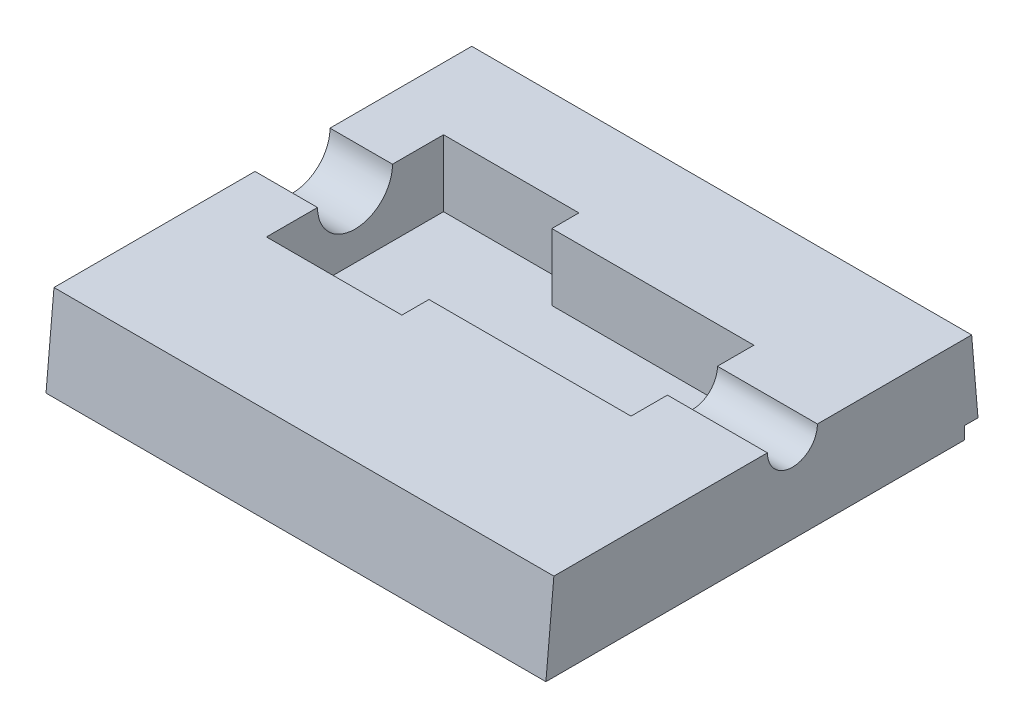
ISO-10303-21;
HEADER;
FILE_DESCRIPTION(('STEP AP214'),'2;1');
FILE_NAME('part.step','',(''),(''),'','','');
FILE_SCHEMA(('AUTOMOTIVE_DESIGN { 1 0 10303 214 1 1 1 1 }'));
ENDSEC;
DATA;
#1=APPLICATION_CONTEXT('core data for automotive mechanical design processes');
#2=APPLICATION_PROTOCOL_DEFINITION('international standard','automotive_design',2000,#1);
#3=PRODUCT_CONTEXT('',#1,'mechanical');
#4=PRODUCT('Part','Part','',(#3));
#5=PRODUCT_RELATED_PRODUCT_CATEGORY('part','',(#4));
#6=PRODUCT_DEFINITION_FORMATION('','',#4);
#7=PRODUCT_DEFINITION_CONTEXT('part definition',#1,'design');
#8=PRODUCT_DEFINITION('design','',#6,#7);
#9=PRODUCT_DEFINITION_SHAPE('','',#8);
#10=(LENGTH_UNIT() NAMED_UNIT(*) SI_UNIT(.MILLI.,.METRE.));
#11=(NAMED_UNIT(*) PLANE_ANGLE_UNIT() SI_UNIT($,.RADIAN.));
#12=(NAMED_UNIT(*) SI_UNIT($,.STERADIAN.) SOLID_ANGLE_UNIT());
#13=UNCERTAINTY_MEASURE_WITH_UNIT(LENGTH_MEASURE(1.E-05),#10,'distance_accuracy_value','');
#14=(GEOMETRIC_REPRESENTATION_CONTEXT(3) GLOBAL_UNCERTAINTY_ASSIGNED_CONTEXT((#13)) GLOBAL_UNIT_ASSIGNED_CONTEXT((#10,
#11,#12)) REPRESENTATION_CONTEXT('',''));
#15=CARTESIAN_POINT('',(0.,0.,0.));
#16=DIRECTION('',(0.,0.,1.));
#17=DIRECTION('',(1.,0.,0.));
#18=AXIS2_PLACEMENT_3D('',#15,#16,#17);
#19=CARTESIAN_POINT('',(0.,3.2,-8.25));
#20=DIRECTION('',(0.,0.,-1.));
#21=DIRECTION('',(-1.,0.,0.));
#22=AXIS2_PLACEMENT_3D('',#19,#20,#21);
#23=PLANE('',#22);
#24=DIRECTION('',(0.,-1.,0.));
#25=VECTOR('',#24,1.);
#26=CARTESIAN_POINT('',(0.,3.2,-8.25));
#27=LINE('',#26,#25);
#28=CARTESIAN_POINT('',(0.,-0.400000000000003,-8.25));
#29=VERTEX_POINT('',#28);
#30=CARTESIAN_POINT('',(0.,-1.,-8.25));
#31=VERTEX_POINT('',#30);
#32=EDGE_CURVE('E165',#29,#31,#27,.T.);
#33=ORIENTED_EDGE('',*,*,#32,.F.);
#34=DIRECTION('',(1.,0.,0.));
#35=VECTOR('',#34,1.);
#36=CARTESIAN_POINT('',(-5.52172685449229,-0.400000000000003,-8.25));
#37=LINE('',#36,#35);
#38=CARTESIAN_POINT('',(24.,-0.400000000000003,-8.25));
#39=VERTEX_POINT('',#38);
#40=EDGE_CURVE('E273',#29,#39,#37,.T.);
#41=ORIENTED_EDGE('',*,*,#40,.T.);
#42=DIRECTION('',(0.,-1.,0.));
#43=VECTOR('',#42,1.);
#44=CARTESIAN_POINT('',(24.,3.2,-8.25));
#45=LINE('',#44,#43);
#46=CARTESIAN_POINT('',(24.,-1.,-8.25));
#47=VERTEX_POINT('',#46);
#48=EDGE_CURVE('E163',#39,#47,#45,.T.);
#49=ORIENTED_EDGE('',*,*,#48,.T.);
#50=DIRECTION('',(1.,0.,0.));
#51=VECTOR('',#50,1.);
#52=CARTESIAN_POINT('',(0.,-1.,-8.25));
#53=LINE('',#52,#51);
#54=EDGE_CURVE('E229',#31,#47,#53,.T.);
#55=ORIENTED_EDGE('',*,*,#54,.F.);
#56=EDGE_LOOP('',(#33,#41,#49,#55));
#57=FACE_BOUND('',#56,.T.);
#58=ADVANCED_FACE('F74',(#57),#23,.T.);
#59=CARTESIAN_POINT('',(19.2,3.2,0.));
#60=DIRECTION('',(-1.,0.,0.));
#61=DIRECTION('',(0.,0.,1.));
#62=AXIS2_PLACEMENT_3D('',#59,#60,#61);
#63=PLANE('',#62);
#64=DIRECTION('',(0.,0.,-1.));
#65=VECTOR('',#64,1.);
#66=CARTESIAN_POINT('',(19.2,0.,0.));
#67=LINE('',#66,#65);
#68=CARTESIAN_POINT('',(19.2,0.,2.95));
#69=VERTEX_POINT('',#68);
#70=CARTESIAN_POINT('',(19.2,0.,-2.95));
#71=VERTEX_POINT('',#70);
#72=EDGE_CURVE('E141',#69,#71,#67,.T.);
#73=ORIENTED_EDGE('',*,*,#72,.F.);
#74=DIRECTION('',(0.,-1.,0.));
#75=VECTOR('',#74,1.);
#76=CARTESIAN_POINT('',(19.2,3.2,2.95));
#77=LINE('',#76,#75);
#78=CARTESIAN_POINT('',(19.2,3.2,2.95));
#79=VERTEX_POINT('',#78);
#80=EDGE_CURVE('E230',#79,#69,#77,.T.);
#81=ORIENTED_EDGE('',*,*,#80,.F.);
#82=DIRECTION('',(0.,0.,1.));
#83=VECTOR('',#82,1.);
#84=CARTESIAN_POINT('',(19.2,3.2,0.));
#85=LINE('',#84,#83);
#86=CARTESIAN_POINT('',(19.2,3.2,1.2));
#87=VERTEX_POINT('',#86);
#88=EDGE_CURVE('E223',#87,#79,#85,.T.);
#89=ORIENTED_EDGE('',*,*,#88,.F.);
#90=CARTESIAN_POINT('',(19.2,3.2,0.));
#91=DIRECTION('',(-1.,0.,0.));
#92=DIRECTION('',(0.,0.,1.));
#93=AXIS2_PLACEMENT_3D('',#90,#91,#92);
#94=CIRCLE('',#93,1.2);
#95=CARTESIAN_POINT('',(19.2,3.2,-1.2));
#96=VERTEX_POINT('',#95);
#97=EDGE_CURVE('E209',#96,#87,#94,.T.);
#98=ORIENTED_EDGE('',*,*,#97,.F.);
#99=DIRECTION('',(0.,0.,-1.));
#100=VECTOR('',#99,1.);
#101=CARTESIAN_POINT('',(19.2,3.2,0.));
#102=LINE('',#101,#100);
#103=CARTESIAN_POINT('',(19.2,3.2,-2.95));
#104=VERTEX_POINT('',#103);
#105=EDGE_CURVE('E235',#96,#104,#102,.T.);
#106=ORIENTED_EDGE('',*,*,#105,.T.);
#107=DIRECTION('',(0.,-1.,0.));
#108=VECTOR('',#107,1.);
#109=CARTESIAN_POINT('',(19.2,3.2,-2.95));
#110=LINE('',#109,#108);
#111=EDGE_CURVE('E12',#104,#71,#110,.T.);
#112=ORIENTED_EDGE('',*,*,#111,.T.);
#113=EDGE_LOOP('',(#73,#81,#89,#98,#106,#112));
#114=FACE_BOUND('',#113,.T.);
#115=ADVANCED_FACE('F357',(#114),#63,.T.);
#116=CARTESIAN_POINT('',(24.,3.2,0.));
#117=DIRECTION('',(1.,0.,0.));
#118=DIRECTION('',(0.,0.,-1.));
#119=AXIS2_PLACEMENT_3D('',#116,#117,#118);
#120=PLANE('',#119);
#121=DIRECTION('',(0.,0.,1.));
#122=VECTOR('',#121,1.);
#123=CARTESIAN_POINT('',(24.,3.2,0.));
#124=LINE('',#123,#122);
#125=CARTESIAN_POINT('',(24.,3.2,-8.60515529470364));
#126=VERTEX_POINT('',#125);
#127=CARTESIAN_POINT('',(24.,3.2,-1.2));
#128=VERTEX_POINT('',#127);
#129=EDGE_CURVE('E83',#126,#128,#124,.T.);
#130=ORIENTED_EDGE('',*,*,#129,.T.);
#131=CARTESIAN_POINT('',(24.,3.2,0.));
#132=DIRECTION('',(-1.,0.,0.));
#133=DIRECTION('',(0.,0.,-1.));
#134=AXIS2_PLACEMENT_3D('',#131,#132,#133);
#135=CIRCLE('',#134,1.2);
#136=CARTESIAN_POINT('',(24.,3.2,1.2));
#137=VERTEX_POINT('',#136);
#138=EDGE_CURVE('E215',#128,#137,#135,.T.);
#139=ORIENTED_EDGE('',*,*,#138,.T.);
#140=DIRECTION('',(0.,0.,-1.));
#141=VECTOR('',#140,1.);
#142=CARTESIAN_POINT('',(24.,3.2,0.));
#143=LINE('',#142,#141);
#144=CARTESIAN_POINT('',(24.,3.2,11.4523076923077));
#145=VERTEX_POINT('',#144);
#146=EDGE_CURVE('E308',#145,#137,#143,.T.);
#147=ORIENTED_EDGE('',*,*,#146,.F.);
#148=DIRECTION('',(0.,-0.995882734463905,0.0906508642909459));
#149=VECTOR('',#148,1.);
#150=CARTESIAN_POINT('',(24.,3.2,11.4523076923077));
#151=LINE('',#150,#149);
#152=CARTESIAN_POINT('',(24.,-1.,11.8346153846154));
#153=VERTEX_POINT('',#152);
#154=EDGE_CURVE('E285',#145,#153,#151,.T.);
#155=ORIENTED_EDGE('',*,*,#154,.T.);
#156=DIRECTION('',(0.,0.,1.));
#157=VECTOR('',#156,1.);
#158=CARTESIAN_POINT('',(24.,-1.,8.25));
#159=LINE('',#158,#157);
#160=EDGE_CURVE('E150',#47,#153,#159,.T.);
#161=ORIENTED_EDGE('',*,*,#160,.F.);
#162=ORIENTED_EDGE('',*,*,#48,.F.);
#163=DIRECTION('',(0.,0.,-1.));
#164=VECTOR('',#163,1.);
#165=CARTESIAN_POINT('',(24.,-0.400000000000003,-8.25));
#166=LINE('',#165,#164);
#167=CARTESIAN_POINT('',(24.,-0.399999999999999,-8.90957411873532));
#168=VERTEX_POINT('',#167);
#169=EDGE_CURVE('E91',#39,#168,#166,.T.);
#170=ORIENTED_EDGE('',*,*,#169,.T.);
#171=DIRECTION('',(0.,0.99644379708425,0.0842600691450143));
#172=VECTOR('',#171,1.);
#173=CARTESIAN_POINT('',(24.,3.2,-8.60515529470364));
#174=LINE('',#173,#172);
#175=EDGE_CURVE('E370',#168,#126,#174,.T.);
#176=ORIENTED_EDGE('',*,*,#175,.T.);
#177=EDGE_LOOP('',(#130,#139,#147,#155,#161,#162,#170,#176));
#178=FACE_BOUND('',#177,.T.);
#179=ADVANCED_FACE('F368',(#178),#120,.T.);
#180=CARTESIAN_POINT('',(0.,3.2,0.));
#181=DIRECTION('',(0.,1.,0.));
#182=DIRECTION('',(0.,0.,1.));
#183=AXIS2_PLACEMENT_3D('',#180,#181,#182);
#184=PLANE('',#183);
#185=ORIENTED_EDGE('',*,*,#105,.F.);
#186=DIRECTION('',(-1.,0.,0.));
#187=VECTOR('',#186,1.);
#188=CARTESIAN_POINT('',(0.,3.2,-1.2));
#189=LINE('',#188,#187);
#190=EDGE_CURVE('E238',#128,#96,#189,.T.);
#191=ORIENTED_EDGE('',*,*,#190,.F.);
#192=ORIENTED_EDGE('',*,*,#129,.F.);
#193=DIRECTION('',(1.,0.,0.));
#194=VECTOR('',#193,1.);
#195=CARTESIAN_POINT('',(-5.52172685449229,3.2,-8.60515529470364));
#196=LINE('',#195,#194);
#197=CARTESIAN_POINT('',(0.,3.2,-8.60515529470364));
#198=VERTEX_POINT('',#197);
#199=EDGE_CURVE('E265',#198,#126,#196,.T.);
#200=ORIENTED_EDGE('',*,*,#199,.F.);
#201=DIRECTION('',(0.,0.,-1.));
#202=VECTOR('',#201,1.);
#203=CARTESIAN_POINT('',(0.,3.2,-1.8));
#204=LINE('',#203,#202);
#205=CARTESIAN_POINT('',(0.,3.2,-1.8));
#206=VERTEX_POINT('',#205);
#207=EDGE_CURVE('E175',#206,#198,#204,.T.);
#208=ORIENTED_EDGE('',*,*,#207,.F.);
#209=DIRECTION('',(-1.,0.,0.));
#210=VECTOR('',#209,1.);
#211=CARTESIAN_POINT('',(3.,3.2,-1.8));
#212=LINE('',#211,#210);
#213=CARTESIAN_POINT('',(3.,3.2,-1.8));
#214=VERTEX_POINT('',#213);
#215=EDGE_CURVE('E246',#214,#206,#212,.T.);
#216=ORIENTED_EDGE('',*,*,#215,.F.);
#217=DIRECTION('',(0.,0.,1.));
#218=VECTOR('',#217,1.);
#219=CARTESIAN_POINT('',(3.,3.2,-4.25));
#220=LINE('',#219,#218);
#221=CARTESIAN_POINT('',(3.,3.2,-4.25));
#222=VERTEX_POINT('',#221);
#223=EDGE_CURVE('E157',#222,#214,#220,.T.);
#224=ORIENTED_EDGE('',*,*,#223,.F.);
#225=DIRECTION('',(-1.,0.,0.));
#226=VECTOR('',#225,1.);
#227=CARTESIAN_POINT('',(9.5,3.2,-4.25));
#228=LINE('',#227,#226);
#229=CARTESIAN_POINT('',(9.5,3.2,-4.25));
#230=VERTEX_POINT('',#229);
#231=EDGE_CURVE('E155',#230,#222,#228,.T.);
#232=ORIENTED_EDGE('',*,*,#231,.F.);
#233=DIRECTION('',(0.,0.,-1.));
#234=VECTOR('',#233,1.);
#235=CARTESIAN_POINT('',(9.5,3.2,-2.95));
#236=LINE('',#235,#234);
#237=CARTESIAN_POINT('',(9.5,3.2,-2.95));
#238=VERTEX_POINT('',#237);
#239=EDGE_CURVE('E137',#238,#230,#236,.T.);
#240=ORIENTED_EDGE('',*,*,#239,.F.);
#241=DIRECTION('',(-1.,0.,0.));
#242=VECTOR('',#241,1.);
#243=CARTESIAN_POINT('',(24.,3.2,-2.95));
#244=LINE('',#243,#242);
#245=EDGE_CURVE('E173',#104,#238,#244,.T.);
#246=ORIENTED_EDGE('',*,*,#245,.F.);
#247=EDGE_LOOP('',(#185,#191,#192,#200,#208,#216,#224,#232,#240,#246));
#248=FACE_BOUND('',#247,.T.);
#249=ADVANCED_FACE('F267',(#248),#184,.T.);
#250=CARTESIAN_POINT('',(9.5,3.2,-2.95));
#251=DIRECTION('',(-1.,0.,0.));
#252=DIRECTION('',(0.,0.,1.));
#253=AXIS2_PLACEMENT_3D('',#250,#251,#252);
#254=PLANE('',#253);
#255=DIRECTION('',(0.,0.,-1.));
#256=VECTOR('',#255,1.);
#257=CARTESIAN_POINT('',(9.5,0.,-2.95));
#258=LINE('',#257,#256);
#259=CARTESIAN_POINT('',(9.5,0.,-2.95));
#260=VERTEX_POINT('',#259);
#261=CARTESIAN_POINT('',(9.5,0.,-4.25));
#262=VERTEX_POINT('',#261);
#263=EDGE_CURVE('E134',#260,#262,#258,.T.);
#264=ORIENTED_EDGE('',*,*,#263,.F.);
#265=DIRECTION('',(0.,-1.,0.));
#266=VECTOR('',#265,1.);
#267=CARTESIAN_POINT('',(9.5,3.2,-2.95));
#268=LINE('',#267,#266);
#269=EDGE_CURVE('E142',#238,#260,#268,.T.);
#270=ORIENTED_EDGE('',*,*,#269,.F.);
#271=ORIENTED_EDGE('',*,*,#239,.T.);
#272=DIRECTION('',(0.,-1.,0.));
#273=VECTOR('',#272,1.);
#274=CARTESIAN_POINT('',(9.5,3.2,-4.25));
#275=LINE('',#274,#273);
#276=EDGE_CURVE('E129',#230,#262,#275,.T.);
#277=ORIENTED_EDGE('',*,*,#276,.T.);
#278=EDGE_LOOP('',(#264,#270,#271,#277));
#279=FACE_BOUND('',#278,.T.);
#280=ADVANCED_FACE('F131',(#279),#254,.T.);
#281=CARTESIAN_POINT('',(24.,3.2,-2.95));
#282=DIRECTION('',(0.,0.,1.));
#283=DIRECTION('',(1.,0.,0.));
#284=AXIS2_PLACEMENT_3D('',#281,#282,#283);
#285=PLANE('',#284);
#286=DIRECTION('',(-1.,0.,0.));
#287=VECTOR('',#286,1.);
#288=CARTESIAN_POINT('',(24.,0.,-2.95));
#289=LINE('',#288,#287);
#290=EDGE_CURVE('E154',#71,#260,#289,.T.);
#291=ORIENTED_EDGE('',*,*,#290,.F.);
#292=ORIENTED_EDGE('',*,*,#111,.F.);
#293=ORIENTED_EDGE('',*,*,#245,.T.);
#294=ORIENTED_EDGE('',*,*,#269,.T.);
#295=EDGE_LOOP('',(#291,#292,#293,#294));
#296=FACE_BOUND('',#295,.T.);
#297=ADVANCED_FACE('F413',(#296),#285,.T.);
#298=CARTESIAN_POINT('',(0.,3.2,-1.8));
#299=DIRECTION('',(-1.,0.,0.));
#300=DIRECTION('',(0.,0.,1.));
#301=AXIS2_PLACEMENT_3D('',#298,#299,#300);
#302=PLANE('',#301);
#303=CARTESIAN_POINT('',(0.,3.2,0.));
#304=DIRECTION('',(1.,0.,0.));
#305=DIRECTION('',(0.,0.,1.));
#306=AXIS2_PLACEMENT_3D('',#303,#304,#305);
#307=CIRCLE('',#306,1.8);
#308=CARTESIAN_POINT('',(0.,3.2,1.8));
#309=VERTEX_POINT('',#308);
#310=EDGE_CURVE('E260',#309,#206,#307,.T.);
#311=ORIENTED_EDGE('',*,*,#310,.T.);
#312=ORIENTED_EDGE('',*,*,#207,.T.);
#313=DIRECTION('',(0.,0.99644379708425,0.0842600691450143));
#314=VECTOR('',#313,1.);
#315=CARTESIAN_POINT('',(0.,3.2,-8.60515529470364));
#316=LINE('',#315,#314);
#317=CARTESIAN_POINT('',(0.,-0.399999999999999,-8.90957411873532));
#318=VERTEX_POINT('',#317);
#319=EDGE_CURVE('E256',#318,#198,#316,.T.);
#320=ORIENTED_EDGE('',*,*,#319,.F.);
#321=DIRECTION('',(0.,0.,-1.));
#322=VECTOR('',#321,1.);
#323=CARTESIAN_POINT('',(0.,-0.400000000000003,-8.25));
#324=LINE('',#323,#322);
#325=EDGE_CURVE('E279',#29,#318,#324,.T.);
#326=ORIENTED_EDGE('',*,*,#325,.F.);
#327=ORIENTED_EDGE('',*,*,#32,.T.);
#328=DIRECTION('',(0.,0.,-1.));
#329=VECTOR('',#328,1.);
#330=CARTESIAN_POINT('',(0.,-1.,8.25));
#331=LINE('',#330,#329);
#332=CARTESIAN_POINT('',(0.,-1.,11.8346153846154));
#333=VERTEX_POINT('',#332);
#334=EDGE_CURVE('E226',#333,#31,#331,.T.);
#335=ORIENTED_EDGE('',*,*,#334,.F.);
#336=DIRECTION('',(0.,-0.995882734463905,0.090650864290946));
#337=VECTOR('',#336,1.);
#338=CARTESIAN_POINT('',(0.,3.2,11.4523076923077));
#339=LINE('',#338,#337);
#340=CARTESIAN_POINT('',(0.,3.2,11.4523076923077));
#341=VERTEX_POINT('',#340);
#342=EDGE_CURVE('E289',#341,#333,#339,.T.);
#343=ORIENTED_EDGE('',*,*,#342,.F.);
#344=DIRECTION('',(0.,0.,1.));
#345=VECTOR('',#344,1.);
#346=CARTESIAN_POINT('',(0.,3.2,1.8));
#347=LINE('',#346,#345);
#348=EDGE_CURVE('E318',#309,#341,#347,.T.);
#349=ORIENTED_EDGE('',*,*,#348,.F.);
#350=EDGE_LOOP('',(#311,#312,#320,#326,#327,#335,#343,#349));
#351=FACE_BOUND('',#350,.T.);
#352=ADVANCED_FACE('F253',(#351),#302,.T.);
#353=CARTESIAN_POINT('',(3.,3.2,-4.25));
#354=DIRECTION('',(1.,0.,0.));
#355=DIRECTION('',(0.,0.,-1.));
#356=AXIS2_PLACEMENT_3D('',#353,#354,#355);
#357=PLANE('',#356);
#358=DIRECTION('',(0.,0.,1.));
#359=VECTOR('',#358,1.);
#360=CARTESIAN_POINT('',(3.,0.,-4.25));
#361=LINE('',#360,#359);
#362=CARTESIAN_POINT('',(3.,0.,-4.25));
#363=VERTEX_POINT('',#362);
#364=CARTESIAN_POINT('',(3.,0.,4.25));
#365=VERTEX_POINT('',#364);
#366=EDGE_CURVE('E149',#363,#365,#361,.T.);
#367=ORIENTED_EDGE('',*,*,#366,.F.);
#368=DIRECTION('',(0.,-1.,0.));
#369=VECTOR('',#368,1.);
#370=CARTESIAN_POINT('',(3.,3.2,-4.25));
#371=LINE('',#370,#369);
#372=EDGE_CURVE('E78',#222,#363,#371,.T.);
#373=ORIENTED_EDGE('',*,*,#372,.F.);
#374=ORIENTED_EDGE('',*,*,#223,.T.);
#375=CARTESIAN_POINT('',(3.,3.2,0.));
#376=DIRECTION('',(1.,0.,0.));
#377=DIRECTION('',(0.,0.,-1.));
#378=AXIS2_PLACEMENT_3D('',#375,#376,#377);
#379=CIRCLE('',#378,1.8);
#380=CARTESIAN_POINT('',(3.,3.2,1.8));
#381=VERTEX_POINT('',#380);
#382=EDGE_CURVE('E298',#381,#214,#379,.T.);
#383=ORIENTED_EDGE('',*,*,#382,.F.);
#384=DIRECTION('',(0.,0.,-1.));
#385=VECTOR('',#384,1.);
#386=CARTESIAN_POINT('',(3.,3.2,4.25));
#387=LINE('',#386,#385);
#388=CARTESIAN_POINT('',(3.,3.2,4.25));
#389=VERTEX_POINT('',#388);
#390=EDGE_CURVE('E196',#389,#381,#387,.T.);
#391=ORIENTED_EDGE('',*,*,#390,.F.);
#392=DIRECTION('',(0.,-1.,0.));
#393=VECTOR('',#392,1.);
#394=CARTESIAN_POINT('',(3.,3.2,4.25));
#395=LINE('',#394,#393);
#396=EDGE_CURVE('E191',#389,#365,#395,.T.);
#397=ORIENTED_EDGE('',*,*,#396,.T.);
#398=EDGE_LOOP('',(#367,#373,#374,#383,#391,#397));
#399=FACE_BOUND('',#398,.T.);
#400=ADVANCED_FACE('F192',(#399),#357,.T.);
#401=CARTESIAN_POINT('',(9.5,3.2,-4.25));
#402=DIRECTION('',(0.,0.,1.));
#403=DIRECTION('',(1.,0.,0.));
#404=AXIS2_PLACEMENT_3D('',#401,#402,#403);
#405=PLANE('',#404);
#406=DIRECTION('',(-1.,0.,0.));
#407=VECTOR('',#406,1.);
#408=CARTESIAN_POINT('',(9.5,0.,-4.25));
#409=LINE('',#408,#407);
#410=EDGE_CURVE('E145',#262,#363,#409,.T.);
#411=ORIENTED_EDGE('',*,*,#410,.F.);
#412=ORIENTED_EDGE('',*,*,#276,.F.);
#413=ORIENTED_EDGE('',*,*,#231,.T.);
#414=ORIENTED_EDGE('',*,*,#372,.T.);
#415=EDGE_LOOP('',(#411,#412,#413,#414));
#416=FACE_BOUND('',#415,.T.);
#417=ADVANCED_FACE('F76',(#416),#405,.T.);
#418=CARTESIAN_POINT('',(0.,0.,0.));
#419=DIRECTION('',(0.,-1.,0.));
#420=DIRECTION('',(0.,0.,-1.));
#421=AXIS2_PLACEMENT_3D('',#418,#419,#420);
#422=PLANE('',#421);
#423=ORIENTED_EDGE('',*,*,#366,.T.);
#424=DIRECTION('',(-1.,0.,0.));
#425=VECTOR('',#424,1.);
#426=CARTESIAN_POINT('',(9.5,0.,4.25));
#427=LINE('',#426,#425);
#428=CARTESIAN_POINT('',(9.5,0.,4.25));
#429=VERTEX_POINT('',#428);
#430=EDGE_CURVE('E184',#429,#365,#427,.T.);
#431=ORIENTED_EDGE('',*,*,#430,.F.);
#432=DIRECTION('',(0.,0.,1.));
#433=VECTOR('',#432,1.);
#434=CARTESIAN_POINT('',(9.5,0.,2.95));
#435=LINE('',#434,#433);
#436=CARTESIAN_POINT('',(9.5,0.,2.95));
#437=VERTEX_POINT('',#436);
#438=EDGE_CURVE('E212',#437,#429,#435,.T.);
#439=ORIENTED_EDGE('',*,*,#438,.F.);
#440=DIRECTION('',(-1.,0.,0.));
#441=VECTOR('',#440,1.);
#442=CARTESIAN_POINT('',(24.,0.,2.95));
#443=LINE('',#442,#441);
#444=EDGE_CURVE('E208',#69,#437,#443,.T.);
#445=ORIENTED_EDGE('',*,*,#444,.F.);
#446=ORIENTED_EDGE('',*,*,#72,.T.);
#447=ORIENTED_EDGE('',*,*,#290,.T.);
#448=ORIENTED_EDGE('',*,*,#263,.T.);
#449=ORIENTED_EDGE('',*,*,#410,.T.);
#450=EDGE_LOOP('',(#423,#431,#439,#445,#446,#447,#448,#449));
#451=FACE_BOUND('',#450,.T.);
#452=ADVANCED_FACE('F152',(#451),#422,.F.);
#453=CARTESIAN_POINT('',(0.,-1.,0.));
#454=DIRECTION('',(0.,-1.,0.));
#455=DIRECTION('',(0.,0.,-1.));
#456=AXIS2_PLACEMENT_3D('',#453,#454,#455);
#457=PLANE('',#456);
#458=ORIENTED_EDGE('',*,*,#334,.T.);
#459=ORIENTED_EDGE('',*,*,#54,.T.);
#460=ORIENTED_EDGE('',*,*,#160,.T.);
#461=DIRECTION('',(1.,0.,0.));
#462=VECTOR('',#461,1.);
#463=CARTESIAN_POINT('',(-5.52172685449229,-1.,11.8346153846154));
#464=LINE('',#463,#462);
#465=EDGE_CURVE('E292',#333,#153,#464,.T.);
#466=ORIENTED_EDGE('',*,*,#465,.F.);
#467=EDGE_LOOP('',(#458,#459,#460,#466));
#468=FACE_BOUND('',#467,.T.);
#469=ADVANCED_FACE('F396',(#468),#457,.T.);
#470=CARTESIAN_POINT('',(0.,3.2,0.));
#471=DIRECTION('',(0.,1.,0.));
#472=DIRECTION('',(0.,0.,-1.));
#473=AXIS2_PLACEMENT_3D('',#470,#471,#472);
#474=PLANE('',#473);
#475=ORIENTED_EDGE('',*,*,#88,.T.);
#476=DIRECTION('',(-1.,0.,0.));
#477=VECTOR('',#476,1.);
#478=CARTESIAN_POINT('',(24.,3.2,2.95));
#479=LINE('',#478,#477);
#480=CARTESIAN_POINT('',(9.5,3.2,2.95));
#481=VERTEX_POINT('',#480);
#482=EDGE_CURVE('E320',#79,#481,#479,.T.);
#483=ORIENTED_EDGE('',*,*,#482,.T.);
#484=DIRECTION('',(0.,0.,1.));
#485=VECTOR('',#484,1.);
#486=CARTESIAN_POINT('',(9.5,3.2,2.95));
#487=LINE('',#486,#485);
#488=CARTESIAN_POINT('',(9.5,3.2,4.25));
#489=VERTEX_POINT('',#488);
#490=EDGE_CURVE('E201',#481,#489,#487,.T.);
#491=ORIENTED_EDGE('',*,*,#490,.T.);
#492=DIRECTION('',(-1.,0.,0.));
#493=VECTOR('',#492,1.);
#494=CARTESIAN_POINT('',(9.5,3.2,4.25));
#495=LINE('',#494,#493);
#496=EDGE_CURVE('E221',#489,#389,#495,.T.);
#497=ORIENTED_EDGE('',*,*,#496,.T.);
#498=ORIENTED_EDGE('',*,*,#390,.T.);
#499=DIRECTION('',(-1.,0.,0.));
#500=VECTOR('',#499,1.);
#501=CARTESIAN_POINT('',(3.,3.2,1.8));
#502=LINE('',#501,#500);
#503=EDGE_CURVE('E315',#381,#309,#502,.T.);
#504=ORIENTED_EDGE('',*,*,#503,.T.);
#505=ORIENTED_EDGE('',*,*,#348,.T.);
#506=DIRECTION('',(1.,0.,0.));
#507=VECTOR('',#506,1.);
#508=CARTESIAN_POINT('',(-5.52172685449229,3.2,11.4523076923077));
#509=LINE('',#508,#507);
#510=EDGE_CURVE('E288',#341,#145,#509,.T.);
#511=ORIENTED_EDGE('',*,*,#510,.T.);
#512=ORIENTED_EDGE('',*,*,#146,.T.);
#513=DIRECTION('',(-1.,0.,0.));
#514=VECTOR('',#513,1.);
#515=CARTESIAN_POINT('',(0.,3.2,1.2));
#516=LINE('',#515,#514);
#517=EDGE_CURVE('E305',#137,#87,#516,.T.);
#518=ORIENTED_EDGE('',*,*,#517,.T.);
#519=EDGE_LOOP('',(#475,#483,#491,#497,#498,#504,#505,#511,#512,#518));
#520=FACE_BOUND('',#519,.T.);
#521=ADVANCED_FACE('F328',(#520),#474,.T.);
#522=CARTESIAN_POINT('',(9.5,3.2,2.95));
#523=DIRECTION('',(-1.,0.,0.));
#524=DIRECTION('',(0.,0.,-1.));
#525=AXIS2_PLACEMENT_3D('',#522,#523,#524);
#526=PLANE('',#525);
#527=ORIENTED_EDGE('',*,*,#438,.T.);
#528=DIRECTION('',(0.,-1.,0.));
#529=VECTOR('',#528,1.);
#530=CARTESIAN_POINT('',(9.5,3.2,4.25));
#531=LINE('',#530,#529);
#532=EDGE_CURVE('E206',#489,#429,#531,.T.);
#533=ORIENTED_EDGE('',*,*,#532,.F.);
#534=ORIENTED_EDGE('',*,*,#490,.F.);
#535=DIRECTION('',(0.,-1.,0.));
#536=VECTOR('',#535,1.);
#537=CARTESIAN_POINT('',(9.5,3.2,2.95));
#538=LINE('',#537,#536);
#539=EDGE_CURVE('E200',#481,#437,#538,.T.);
#540=ORIENTED_EDGE('',*,*,#539,.T.);
#541=EDGE_LOOP('',(#527,#533,#534,#540));
#542=FACE_BOUND('',#541,.T.);
#543=ADVANCED_FACE('F332',(#542),#526,.T.);
#544=CARTESIAN_POINT('',(24.,3.2,2.95));
#545=DIRECTION('',(0.,0.,-1.));
#546=DIRECTION('',(1.,0.,0.));
#547=AXIS2_PLACEMENT_3D('',#544,#545,#546);
#548=PLANE('',#547);
#549=ORIENTED_EDGE('',*,*,#444,.T.);
#550=ORIENTED_EDGE('',*,*,#539,.F.);
#551=ORIENTED_EDGE('',*,*,#482,.F.);
#552=ORIENTED_EDGE('',*,*,#80,.T.);
#553=EDGE_LOOP('',(#549,#550,#551,#552));
#554=FACE_BOUND('',#553,.T.);
#555=ADVANCED_FACE('F427',(#554),#548,.T.);
#556=CARTESIAN_POINT('',(9.5,3.2,4.25));
#557=DIRECTION('',(0.,0.,-1.));
#558=DIRECTION('',(1.,0.,0.));
#559=AXIS2_PLACEMENT_3D('',#556,#557,#558);
#560=PLANE('',#559);
#561=ORIENTED_EDGE('',*,*,#430,.T.);
#562=ORIENTED_EDGE('',*,*,#396,.F.);
#563=ORIENTED_EDGE('',*,*,#496,.F.);
#564=ORIENTED_EDGE('',*,*,#532,.T.);
#565=EDGE_LOOP('',(#561,#562,#563,#564));
#566=FACE_BOUND('',#565,.T.);
#567=ADVANCED_FACE('F204',(#566),#560,.T.);
#568=CARTESIAN_POINT('',(15.2,3.2,0.));
#569=DIRECTION('',(1.,0.,0.));
#570=DIRECTION('',(0.,0.,-1.));
#571=AXIS2_PLACEMENT_3D('',#568,#569,#570);
#572=CYLINDRICAL_SURFACE('',#571,1.2);
#573=ORIENTED_EDGE('',*,*,#190,.T.);
#574=ORIENTED_EDGE('',*,*,#97,.T.);
#575=ORIENTED_EDGE('',*,*,#517,.F.);
#576=ORIENTED_EDGE('',*,*,#138,.F.);
#577=EDGE_LOOP('',(#573,#574,#575,#576));
#578=FACE_BOUND('',#577,.T.);
#579=ADVANCED_FACE('F365',(#578),#572,.F.);
#580=CARTESIAN_POINT('',(7.81663783151692,3.2,0.));
#581=DIRECTION('',(-1.,0.,0.));
#582=DIRECTION('',(0.,0.,1.));
#583=AXIS2_PLACEMENT_3D('',#580,#581,#582);
#584=CYLINDRICAL_SURFACE('',#583,1.8);
#585=ORIENTED_EDGE('',*,*,#503,.F.);
#586=ORIENTED_EDGE('',*,*,#382,.T.);
#587=ORIENTED_EDGE('',*,*,#215,.T.);
#588=ORIENTED_EDGE('',*,*,#310,.F.);
#589=EDGE_LOOP('',(#585,#586,#587,#588));
#590=FACE_BOUND('',#589,.T.);
#591=ADVANCED_FACE('F353',(#590),#584,.F.);
#592=CARTESIAN_POINT('',(-5.52172685449229,3.2,11.4523076923077));
#593=DIRECTION('',(0.,0.0906508642909459,0.995882734463905));
#594=DIRECTION('',(0.,-0.995882734463905,0.090650864290946));
#595=AXIS2_PLACEMENT_3D('',#592,#593,#594);
#596=PLANE('',#595);
#597=ORIENTED_EDGE('',*,*,#510,.F.);
#598=ORIENTED_EDGE('',*,*,#342,.T.);
#599=ORIENTED_EDGE('',*,*,#465,.T.);
#600=ORIENTED_EDGE('',*,*,#154,.F.);
#601=EDGE_LOOP('',(#597,#598,#599,#600));
#602=FACE_BOUND('',#601,.T.);
#603=ADVANCED_FACE('F392',(#602),#596,.T.);
#604=CARTESIAN_POINT('',(-5.52172685449229,-0.400000000000003,-8.25));
#605=DIRECTION('',(0.,-1.,0.));
#606=DIRECTION('',(0.,0.,-1.));
#607=AXIS2_PLACEMENT_3D('',#604,#605,#606);
#608=PLANE('',#607);
#609=ORIENTED_EDGE('',*,*,#40,.F.);
#610=ORIENTED_EDGE('',*,*,#325,.T.);
#611=DIRECTION('',(1.,0.,0.));
#612=VECTOR('',#611,1.);
#613=CARTESIAN_POINT('',(-5.52172685449229,-0.399999999999999,-8.90957411873532));
#614=LINE('',#613,#612);
#615=EDGE_CURVE('E276',#318,#168,#614,.T.);
#616=ORIENTED_EDGE('',*,*,#615,.T.);
#617=ORIENTED_EDGE('',*,*,#169,.F.);
#618=EDGE_LOOP('',(#609,#610,#616,#617));
#619=FACE_BOUND('',#618,.T.);
#620=ADVANCED_FACE('F376',(#619),#608,.T.);
#621=CARTESIAN_POINT('',(-5.52172685449229,3.2,-8.60515529470364));
#622=DIRECTION('',(0.,0.0842600691450143,-0.99644379708425));
#623=DIRECTION('',(0.,0.99644379708425,0.0842600691450143));
#624=AXIS2_PLACEMENT_3D('',#621,#622,#623);
#625=PLANE('',#624);
#626=ORIENTED_EDGE('',*,*,#615,.F.);
#627=ORIENTED_EDGE('',*,*,#319,.T.);
#628=ORIENTED_EDGE('',*,*,#199,.T.);
#629=ORIENTED_EDGE('',*,*,#175,.F.);
#630=EDGE_LOOP('',(#626,#627,#628,#629));
#631=FACE_BOUND('',#630,.T.);
#632=ADVANCED_FACE('F275',(#631),#625,.T.);
#633=CLOSED_SHELL('',(#58,#115,#179,#249,#280,#297,#352,#400,#417,#452,#469,#521,#543,#555,#567,
#579,#591,#603,#620,#632));
#634=MANIFOLD_SOLID_BREP('B2',#633);
#635=ADVANCED_BREP_SHAPE_REPRESENTATION('',(#18,#634),#14);
#636=SHAPE_DEFINITION_REPRESENTATION(#9,#635);
ENDSEC;
END-ISO-10303-21;
